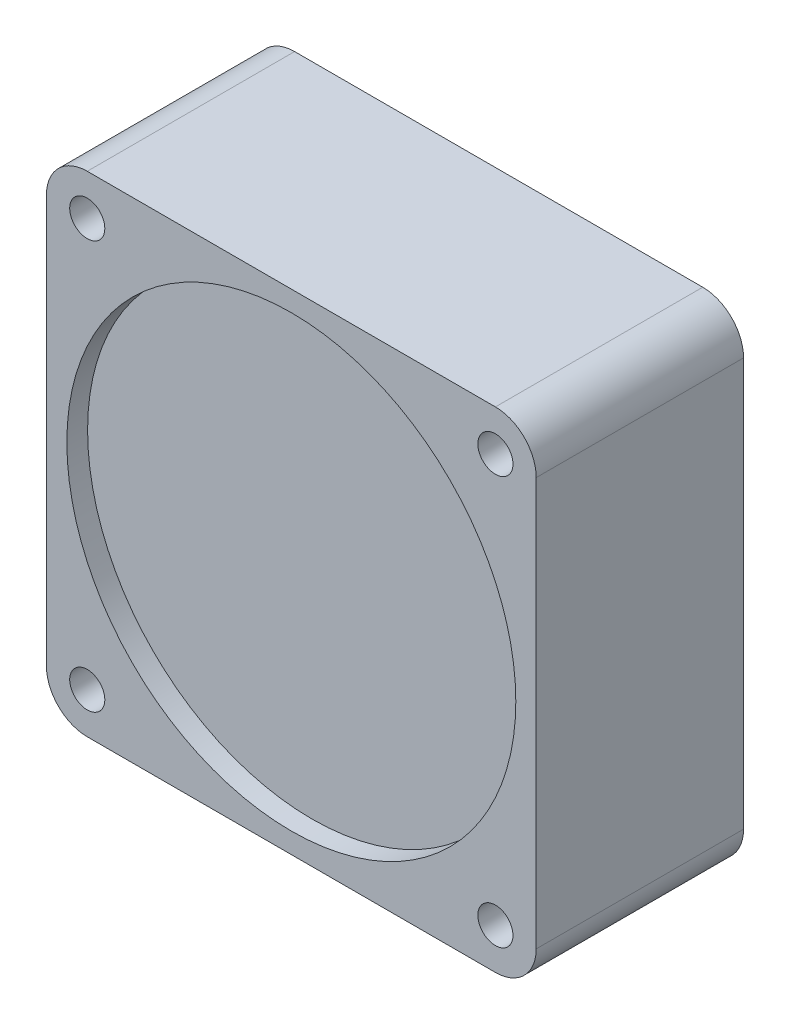
ISO-10303-21;
HEADER;
FILE_DESCRIPTION(('STEP AP214'),'2;1');
FILE_NAME('part.step','',(''),(''),'','','');
FILE_SCHEMA(('AUTOMOTIVE_DESIGN { 1 0 10303 214 1 1 1 1 }'));
ENDSEC;
DATA;
#1=APPLICATION_CONTEXT('core data for automotive mechanical design processes');
#2=APPLICATION_PROTOCOL_DEFINITION('international standard','automotive_design',2000,#1);
#3=PRODUCT_CONTEXT('',#1,'mechanical');
#4=PRODUCT('Part','Part','',(#3));
#5=PRODUCT_RELATED_PRODUCT_CATEGORY('part','',(#4));
#6=PRODUCT_DEFINITION_FORMATION('','',#4);
#7=PRODUCT_DEFINITION_CONTEXT('part definition',#1,'design');
#8=PRODUCT_DEFINITION('design','',#6,#7);
#9=PRODUCT_DEFINITION_SHAPE('','',#8);
#10=(LENGTH_UNIT() NAMED_UNIT(*) SI_UNIT(.MILLI.,.METRE.));
#11=(NAMED_UNIT(*) PLANE_ANGLE_UNIT() SI_UNIT($,.RADIAN.));
#12=(NAMED_UNIT(*) SI_UNIT($,.STERADIAN.) SOLID_ANGLE_UNIT());
#13=UNCERTAINTY_MEASURE_WITH_UNIT(LENGTH_MEASURE(1.E-05),#10,'distance_accuracy_value','');
#14=(GEOMETRIC_REPRESENTATION_CONTEXT(3) GLOBAL_UNCERTAINTY_ASSIGNED_CONTEXT((#13)) GLOBAL_UNIT_ASSIGNED_CONTEXT((#10,
#11,#12)) REPRESENTATION_CONTEXT('',''));
#15=CARTESIAN_POINT('',(0.,0.,0.));
#16=DIRECTION('',(0.,0.,1.));
#17=DIRECTION('',(1.,0.,0.));
#18=AXIS2_PLACEMENT_3D('',#15,#16,#17);
#19=CARTESIAN_POINT('',(0.,-30.,25.4));
#20=DIRECTION('',(0.,1.,0.));
#21=DIRECTION('',(0.,0.,1.));
#22=AXIS2_PLACEMENT_3D('',#19,#20,#21);
#23=PLANE('',#22);
#24=DIRECTION('',(1.,0.,0.));
#25=VECTOR('',#24,1.);
#26=CARTESIAN_POINT('',(0.,-30.,0.));
#27=LINE('',#26,#25);
#28=CARTESIAN_POINT('',(-25.000000038,-30.,0.));
#29=VERTEX_POINT('',#28);
#30=CARTESIAN_POINT('',(25.000000038,-30.,0.));
#31=VERTEX_POINT('',#30);
#32=EDGE_CURVE('E144',#29,#31,#27,.T.);
#33=ORIENTED_EDGE('',*,*,#32,.T.);
#34=DIRECTION('',(0.,0.,-1.));
#35=VECTOR('',#34,1.);
#36=CARTESIAN_POINT('',(25.000000038,-30.,25.4));
#37=LINE('',#36,#35);
#38=CARTESIAN_POINT('',(25.000000038,-30.,25.4));
#39=VERTEX_POINT('',#38);
#40=EDGE_CURVE('E11',#39,#31,#37,.T.);
#41=ORIENTED_EDGE('',*,*,#40,.F.);
#42=DIRECTION('',(1.,0.,0.));
#43=VECTOR('',#42,1.);
#44=CARTESIAN_POINT('',(0.,-30.,25.4));
#45=LINE('',#44,#43);
#46=CARTESIAN_POINT('',(-25.000000038,-30.,25.4));
#47=VERTEX_POINT('',#46);
#48=EDGE_CURVE('E187',#47,#39,#45,.T.);
#49=ORIENTED_EDGE('',*,*,#48,.F.);
#50=DIRECTION('',(0.,0.,-1.));
#51=VECTOR('',#50,1.);
#52=CARTESIAN_POINT('',(-25.000000038,-30.,25.4));
#53=LINE('',#52,#51);
#54=EDGE_CURVE('E130',#47,#29,#53,.T.);
#55=ORIENTED_EDGE('',*,*,#54,.T.);
#56=EDGE_LOOP('',(#33,#41,#49,#55));
#57=FACE_BOUND('',#56,.T.);
#58=ADVANCED_FACE('F33',(#57),#23,.F.);
#59=CARTESIAN_POINT('',(25.000000038,-25.,25.4));
#60=DIRECTION('',(0.,0.,-1.));
#61=DIRECTION('',(-1.,0.,0.));
#62=AXIS2_PLACEMENT_3D('',#59,#60,#61);
#63=CYLINDRICAL_SURFACE('',#62,5.00000000000001);
#64=CARTESIAN_POINT('',(25.000000038,-25.,0.));
#65=DIRECTION('',(0.,0.,1.));
#66=DIRECTION('',(1.,0.,0.));
#67=AXIS2_PLACEMENT_3D('',#64,#65,#66);
#68=CIRCLE('',#67,5.00000000000001);
#69=CARTESIAN_POINT('',(30.,-25.,0.));
#70=VERTEX_POINT('',#69);
#71=EDGE_CURVE('E147',#31,#70,#68,.T.);
#72=ORIENTED_EDGE('',*,*,#71,.T.);
#73=DIRECTION('',(0.,0.,-1.));
#74=VECTOR('',#73,1.);
#75=CARTESIAN_POINT('',(30.,-25.,25.4));
#76=LINE('',#75,#74);
#77=CARTESIAN_POINT('',(30.,-25.,25.4));
#78=VERTEX_POINT('',#77);
#79=EDGE_CURVE('E42',#78,#70,#76,.T.);
#80=ORIENTED_EDGE('',*,*,#79,.F.);
#81=CARTESIAN_POINT('',(25.000000038,-25.,25.4));
#82=DIRECTION('',(0.,0.,1.));
#83=DIRECTION('',(1.,0.,0.));
#84=AXIS2_PLACEMENT_3D('',#81,#82,#83);
#85=CIRCLE('',#84,5.00000000000001);
#86=EDGE_CURVE('E92',#39,#78,#85,.T.);
#87=ORIENTED_EDGE('',*,*,#86,.F.);
#88=ORIENTED_EDGE('',*,*,#40,.T.);
#89=EDGE_LOOP('',(#72,#80,#87,#88));
#90=FACE_BOUND('',#89,.T.);
#91=ADVANCED_FACE('F175',(#90),#63,.T.);
#92=CARTESIAN_POINT('',(30.,0.,25.4));
#93=DIRECTION('',(1.,0.,0.));
#94=DIRECTION('',(0.,1.,0.));
#95=AXIS2_PLACEMENT_3D('',#92,#93,#94);
#96=PLANE('',#95);
#97=DIRECTION('',(0.,-1.,0.));
#98=VECTOR('',#97,1.);
#99=CARTESIAN_POINT('',(30.,0.,0.));
#100=LINE('',#99,#98);
#101=CARTESIAN_POINT('',(30.,25.,0.));
#102=VERTEX_POINT('',#101);
#103=EDGE_CURVE('E150',#102,#70,#100,.T.);
#104=ORIENTED_EDGE('',*,*,#103,.F.);
#105=DIRECTION('',(0.,0.,-1.));
#106=VECTOR('',#105,1.);
#107=CARTESIAN_POINT('',(30.,25.,25.4));
#108=LINE('',#107,#106);
#109=CARTESIAN_POINT('',(30.,25.,25.4));
#110=VERTEX_POINT('',#109);
#111=EDGE_CURVE('E168',#110,#102,#108,.T.);
#112=ORIENTED_EDGE('',*,*,#111,.F.);
#113=DIRECTION('',(0.,-1.,0.));
#114=VECTOR('',#113,1.);
#115=CARTESIAN_POINT('',(30.,0.,25.4));
#116=LINE('',#115,#114);
#117=EDGE_CURVE('E174',#110,#78,#116,.T.);
#118=ORIENTED_EDGE('',*,*,#117,.T.);
#119=ORIENTED_EDGE('',*,*,#79,.T.);
#120=EDGE_LOOP('',(#104,#112,#118,#119));
#121=FACE_BOUND('',#120,.T.);
#122=ADVANCED_FACE('F172',(#121),#96,.T.);
#123=CARTESIAN_POINT('',(25.000000038,25.,25.4));
#124=DIRECTION('',(0.,0.,-1.));
#125=DIRECTION('',(-1.,0.,0.));
#126=AXIS2_PLACEMENT_3D('',#123,#124,#125);
#127=CYLINDRICAL_SURFACE('',#126,4.99999998099999);
#128=CARTESIAN_POINT('',(25.000000038,25.,0.));
#129=DIRECTION('',(0.,0.,1.));
#130=DIRECTION('',(1.,0.,0.));
#131=AXIS2_PLACEMENT_3D('',#128,#129,#130);
#132=CIRCLE('',#131,4.99999998099999);
#133=CARTESIAN_POINT('',(25.000000038,30.,0.));
#134=VERTEX_POINT('',#133);
#135=EDGE_CURVE('E153',#102,#134,#132,.T.);
#136=ORIENTED_EDGE('',*,*,#135,.T.);
#137=DIRECTION('',(0.,0.,-1.));
#138=VECTOR('',#137,1.);
#139=CARTESIAN_POINT('',(25.000000038,30.,25.4));
#140=LINE('',#139,#138);
#141=CARTESIAN_POINT('',(25.000000038,30.,25.4));
#142=VERTEX_POINT('',#141);
#143=EDGE_CURVE('E166',#142,#134,#140,.T.);
#144=ORIENTED_EDGE('',*,*,#143,.F.);
#145=CARTESIAN_POINT('',(25.000000038,25.,25.4));
#146=DIRECTION('',(0.,0.,1.));
#147=DIRECTION('',(1.,0.,0.));
#148=AXIS2_PLACEMENT_3D('',#145,#146,#147);
#149=CIRCLE('',#148,4.99999998099999);
#150=EDGE_CURVE('E125',#110,#142,#149,.T.);
#151=ORIENTED_EDGE('',*,*,#150,.F.);
#152=ORIENTED_EDGE('',*,*,#111,.T.);
#153=EDGE_LOOP('',(#136,#144,#151,#152));
#154=FACE_BOUND('',#153,.T.);
#155=ADVANCED_FACE('F184',(#154),#127,.T.);
#156=CARTESIAN_POINT('',(0.,30.,25.4));
#157=DIRECTION('',(0.,1.,0.));
#158=DIRECTION('',(0.,0.,1.));
#159=AXIS2_PLACEMENT_3D('',#156,#157,#158);
#160=PLANE('',#159);
#161=DIRECTION('',(1.,0.,0.));
#162=VECTOR('',#161,1.);
#163=CARTESIAN_POINT('',(0.,30.,0.));
#164=LINE('',#163,#162);
#165=CARTESIAN_POINT('',(-25.000000038,30.,0.));
#166=VERTEX_POINT('',#165);
#167=EDGE_CURVE('E156',#166,#134,#164,.T.);
#168=ORIENTED_EDGE('',*,*,#167,.F.);
#169=DIRECTION('',(0.,0.,-1.));
#170=VECTOR('',#169,1.);
#171=CARTESIAN_POINT('',(-25.000000038,30.,25.4));
#172=LINE('',#171,#170);
#173=CARTESIAN_POINT('',(-25.000000038,30.,25.4));
#174=VERTEX_POINT('',#173);
#175=EDGE_CURVE('E114',#174,#166,#172,.T.);
#176=ORIENTED_EDGE('',*,*,#175,.F.);
#177=DIRECTION('',(1.,0.,0.));
#178=VECTOR('',#177,1.);
#179=CARTESIAN_POINT('',(0.,30.,25.4));
#180=LINE('',#179,#178);
#181=EDGE_CURVE('E123',#174,#142,#180,.T.);
#182=ORIENTED_EDGE('',*,*,#181,.T.);
#183=ORIENTED_EDGE('',*,*,#143,.T.);
#184=EDGE_LOOP('',(#168,#176,#182,#183));
#185=FACE_BOUND('',#184,.T.);
#186=ADVANCED_FACE('F277',(#185),#160,.T.);
#187=CARTESIAN_POINT('',(-25.000000038,25.,25.4));
#188=DIRECTION('',(0.,0.,-1.));
#189=DIRECTION('',(-1.,0.,0.));
#190=AXIS2_PLACEMENT_3D('',#187,#188,#189);
#191=CYLINDRICAL_SURFACE('',#190,4.999999981);
#192=CARTESIAN_POINT('',(-25.000000038,25.,0.));
#193=DIRECTION('',(0.,0.,1.));
#194=DIRECTION('',(1.,0.,0.));
#195=AXIS2_PLACEMENT_3D('',#192,#193,#194);
#196=CIRCLE('',#195,4.999999981);
#197=CARTESIAN_POINT('',(-30.,25.,0.));
#198=VERTEX_POINT('',#197);
#199=EDGE_CURVE('E113',#198,#166,#196,.F.);
#200=ORIENTED_EDGE('',*,*,#199,.F.);
#201=DIRECTION('',(0.,0.,-1.));
#202=VECTOR('',#201,1.);
#203=CARTESIAN_POINT('',(-30.,25.,25.4));
#204=LINE('',#203,#202);
#205=CARTESIAN_POINT('',(-30.,25.,25.4));
#206=VERTEX_POINT('',#205);
#207=EDGE_CURVE('E107',#206,#198,#204,.T.);
#208=ORIENTED_EDGE('',*,*,#207,.F.);
#209=CARTESIAN_POINT('',(-25.000000038,25.,25.4));
#210=DIRECTION('',(0.,0.,1.));
#211=DIRECTION('',(1.,0.,0.));
#212=AXIS2_PLACEMENT_3D('',#209,#210,#211);
#213=CIRCLE('',#212,4.999999981);
#214=EDGE_CURVE('E111',#206,#174,#213,.F.);
#215=ORIENTED_EDGE('',*,*,#214,.T.);
#216=ORIENTED_EDGE('',*,*,#175,.T.);
#217=EDGE_LOOP('',(#200,#208,#215,#216));
#218=FACE_BOUND('',#217,.T.);
#219=ADVANCED_FACE('F109',(#218),#191,.T.);
#220=CARTESIAN_POINT('',(-30.,0.,25.4));
#221=DIRECTION('',(1.,0.,0.));
#222=DIRECTION('',(0.,1.,0.));
#223=AXIS2_PLACEMENT_3D('',#220,#221,#222);
#224=PLANE('',#223);
#225=DIRECTION('',(0.,-1.,0.));
#226=VECTOR('',#225,1.);
#227=CARTESIAN_POINT('',(-30.,0.,0.));
#228=LINE('',#227,#226);
#229=CARTESIAN_POINT('',(-30.,-25.,0.));
#230=VERTEX_POINT('',#229);
#231=EDGE_CURVE('E78',#198,#230,#228,.T.);
#232=ORIENTED_EDGE('',*,*,#231,.T.);
#233=DIRECTION('',(0.,0.,-1.));
#234=VECTOR('',#233,1.);
#235=CARTESIAN_POINT('',(-30.,-25.,25.4));
#236=LINE('',#235,#234);
#237=CARTESIAN_POINT('',(-30.,-25.,25.4));
#238=VERTEX_POINT('',#237);
#239=EDGE_CURVE('E115',#238,#230,#236,.T.);
#240=ORIENTED_EDGE('',*,*,#239,.F.);
#241=DIRECTION('',(0.,-1.,0.));
#242=VECTOR('',#241,1.);
#243=CARTESIAN_POINT('',(-30.,0.,25.4));
#244=LINE('',#243,#242);
#245=EDGE_CURVE('E117',#206,#238,#244,.T.);
#246=ORIENTED_EDGE('',*,*,#245,.F.);
#247=ORIENTED_EDGE('',*,*,#207,.T.);
#248=EDGE_LOOP('',(#232,#240,#246,#247));
#249=FACE_BOUND('',#248,.T.);
#250=ADVANCED_FACE('F118',(#249),#224,.F.);
#251=CARTESIAN_POINT('',(-25.000000038,25.,25.4));
#252=DIRECTION('',(0.,0.,-1.));
#253=DIRECTION('',(-1.,0.,0.));
#254=AXIS2_PLACEMENT_3D('',#251,#252,#253);
#255=CYLINDRICAL_SURFACE('',#254,2.15);
#256=CARTESIAN_POINT('',(-25.000000038,25.,25.4));
#257=DIRECTION('',(0.,0.,1.));
#258=DIRECTION('',(1.,0.,0.));
#259=AXIS2_PLACEMENT_3D('',#256,#257,#258);
#260=CIRCLE('',#259,2.15);
#261=CARTESIAN_POINT('',(-22.850000038,25.,25.4));
#262=VERTEX_POINT('',#261);
#263=EDGE_CURVE('E191',#262,#262,#260,.T.);
#264=ORIENTED_EDGE('',*,*,#263,.T.);
#265=EDGE_LOOP('',(#264));
#266=FACE_BOUND('',#265,.T.);
#267=CARTESIAN_POINT('',(-25.000000038,25.,0.));
#268=DIRECTION('',(0.,0.,1.));
#269=DIRECTION('',(1.,0.,0.));
#270=AXIS2_PLACEMENT_3D('',#267,#268,#269);
#271=CIRCLE('',#270,2.15);
#272=CARTESIAN_POINT('',(-22.850000038,25.,0.));
#273=VERTEX_POINT('',#272);
#274=EDGE_CURVE('E141',#273,#273,#271,.T.);
#275=ORIENTED_EDGE('',*,*,#274,.F.);
#276=EDGE_LOOP('',(#275));
#277=FACE_BOUND('',#276,.T.);
#278=ADVANCED_FACE('F228',(#266,#277),#255,.F.);
#279=CARTESIAN_POINT('',(25.000000038,25.,25.4));
#280=DIRECTION('',(0.,0.,-1.));
#281=DIRECTION('',(-1.,0.,0.));
#282=AXIS2_PLACEMENT_3D('',#279,#280,#281);
#283=CYLINDRICAL_SURFACE('',#282,2.15);
#284=CARTESIAN_POINT('',(25.000000038,25.,25.4));
#285=DIRECTION('',(0.,0.,1.));
#286=DIRECTION('',(1.,0.,0.));
#287=AXIS2_PLACEMENT_3D('',#284,#285,#286);
#288=CIRCLE('',#287,2.15);
#289=CARTESIAN_POINT('',(27.150000038,25.,25.4));
#290=VERTEX_POINT('',#289);
#291=EDGE_CURVE('E194',#290,#290,#288,.T.);
#292=ORIENTED_EDGE('',*,*,#291,.T.);
#293=EDGE_LOOP('',(#292));
#294=FACE_BOUND('',#293,.T.);
#295=CARTESIAN_POINT('',(25.000000038,25.,0.));
#296=DIRECTION('',(0.,0.,1.));
#297=DIRECTION('',(1.,0.,0.));
#298=AXIS2_PLACEMENT_3D('',#295,#296,#297);
#299=CIRCLE('',#298,2.15);
#300=CARTESIAN_POINT('',(27.150000038,25.,0.));
#301=VERTEX_POINT('',#300);
#302=EDGE_CURVE('E138',#301,#301,#299,.T.);
#303=ORIENTED_EDGE('',*,*,#302,.F.);
#304=EDGE_LOOP('',(#303));
#305=FACE_BOUND('',#304,.T.);
#306=ADVANCED_FACE('F231',(#294,#305),#283,.F.);
#307=CARTESIAN_POINT('',(25.000000038,-25.,25.4));
#308=DIRECTION('',(0.,0.,-1.));
#309=DIRECTION('',(-1.,0.,0.));
#310=AXIS2_PLACEMENT_3D('',#307,#308,#309);
#311=CYLINDRICAL_SURFACE('',#310,2.15);
#312=CARTESIAN_POINT('',(25.000000038,-25.,25.4));
#313=DIRECTION('',(0.,0.,1.));
#314=DIRECTION('',(1.,0.,0.));
#315=AXIS2_PLACEMENT_3D('',#312,#313,#314);
#316=CIRCLE('',#315,2.15);
#317=CARTESIAN_POINT('',(27.150000038,-25.,25.4));
#318=VERTEX_POINT('',#317);
#319=EDGE_CURVE('E197',#318,#318,#316,.T.);
#320=ORIENTED_EDGE('',*,*,#319,.T.);
#321=EDGE_LOOP('',(#320));
#322=FACE_BOUND('',#321,.T.);
#323=CARTESIAN_POINT('',(25.000000038,-25.,0.));
#324=DIRECTION('',(0.,0.,1.));
#325=DIRECTION('',(1.,0.,0.));
#326=AXIS2_PLACEMENT_3D('',#323,#324,#325);
#327=CIRCLE('',#326,2.15);
#328=CARTESIAN_POINT('',(27.150000038,-25.,0.));
#329=VERTEX_POINT('',#328);
#330=EDGE_CURVE('E134',#329,#329,#327,.T.);
#331=ORIENTED_EDGE('',*,*,#330,.F.);
#332=EDGE_LOOP('',(#331));
#333=FACE_BOUND('',#332,.T.);
#334=ADVANCED_FACE('F252',(#322,#333),#311,.F.);
#335=CARTESIAN_POINT('',(-25.000000038,-25.,25.4));
#336=DIRECTION('',(0.,0.,-1.));
#337=DIRECTION('',(-1.,0.,0.));
#338=AXIS2_PLACEMENT_3D('',#335,#336,#337);
#339=CYLINDRICAL_SURFACE('',#338,2.15);
#340=CARTESIAN_POINT('',(-25.000000038,-25.,25.4));
#341=DIRECTION('',(0.,0.,1.));
#342=DIRECTION('',(1.,0.,0.));
#343=AXIS2_PLACEMENT_3D('',#340,#341,#342);
#344=CIRCLE('',#343,2.15);
#345=CARTESIAN_POINT('',(-22.850000038,-25.,25.4));
#346=VERTEX_POINT('',#345);
#347=EDGE_CURVE('E162',#346,#346,#344,.T.);
#348=ORIENTED_EDGE('',*,*,#347,.T.);
#349=EDGE_LOOP('',(#348));
#350=FACE_BOUND('',#349,.T.);
#351=CARTESIAN_POINT('',(-25.000000038,-25.,0.));
#352=DIRECTION('',(0.,0.,1.));
#353=DIRECTION('',(1.,0.,0.));
#354=AXIS2_PLACEMENT_3D('',#351,#352,#353);
#355=CIRCLE('',#354,2.15);
#356=CARTESIAN_POINT('',(-22.850000038,-25.,0.));
#357=VERTEX_POINT('',#356);
#358=EDGE_CURVE('E131',#357,#357,#355,.T.);
#359=ORIENTED_EDGE('',*,*,#358,.F.);
#360=EDGE_LOOP('',(#359));
#361=FACE_BOUND('',#360,.T.);
#362=ADVANCED_FACE('F35',(#350,#361),#339,.F.);
#363=CARTESIAN_POINT('',(-25.000000038,-25.,25.4));
#364=DIRECTION('',(0.,0.,-1.));
#365=DIRECTION('',(-1.,0.,0.));
#366=AXIS2_PLACEMENT_3D('',#363,#364,#365);
#367=CYLINDRICAL_SURFACE('',#366,4.999999981);
#368=CARTESIAN_POINT('',(-25.000000038,-25.,0.));
#369=DIRECTION('',(0.,0.,1.));
#370=DIRECTION('',(1.,0.,0.));
#371=AXIS2_PLACEMENT_3D('',#368,#369,#370);
#372=CIRCLE('',#371,4.999999981);
#373=EDGE_CURVE('E84',#230,#29,#372,.T.);
#374=ORIENTED_EDGE('',*,*,#373,.T.);
#375=ORIENTED_EDGE('',*,*,#54,.F.);
#376=CARTESIAN_POINT('',(-25.000000038,-25.,25.4));
#377=DIRECTION('',(0.,0.,1.));
#378=DIRECTION('',(1.,0.,0.));
#379=AXIS2_PLACEMENT_3D('',#376,#377,#378);
#380=CIRCLE('',#379,4.999999981);
#381=EDGE_CURVE('E50',#238,#47,#380,.T.);
#382=ORIENTED_EDGE('',*,*,#381,.F.);
#383=ORIENTED_EDGE('',*,*,#239,.T.);
#384=EDGE_LOOP('',(#374,#375,#382,#383));
#385=FACE_BOUND('',#384,.T.);
#386=ADVANCED_FACE('F218',(#385),#367,.T.);
#387=CARTESIAN_POINT('',(0.,0.,25.4));
#388=DIRECTION('',(0.,0.,1.));
#389=DIRECTION('',(1.,0.,0.));
#390=AXIS2_PLACEMENT_3D('',#387,#388,#389);
#391=PLANE('',#390);
#392=CARTESIAN_POINT('',(0.,0.,25.4));
#393=DIRECTION('',(0.,0.,1.));
#394=DIRECTION('',(1.,0.,0.));
#395=AXIS2_PLACEMENT_3D('',#392,#393,#394);
#396=CIRCLE('',#395,27.5);
#397=CARTESIAN_POINT('',(27.5,0.,25.4));
#398=VERTEX_POINT('',#397);
#399=EDGE_CURVE('E202',#398,#398,#396,.T.);
#400=ORIENTED_EDGE('',*,*,#399,.F.);
#401=EDGE_LOOP('',(#400));
#402=FACE_BOUND('',#401,.T.);
#403=ORIENTED_EDGE('',*,*,#347,.F.);
#404=EDGE_LOOP('',(#403));
#405=FACE_BOUND('',#404,.T.);
#406=ORIENTED_EDGE('',*,*,#319,.F.);
#407=EDGE_LOOP('',(#406));
#408=FACE_BOUND('',#407,.T.);
#409=ORIENTED_EDGE('',*,*,#291,.F.);
#410=EDGE_LOOP('',(#409));
#411=FACE_BOUND('',#410,.T.);
#412=ORIENTED_EDGE('',*,*,#263,.F.);
#413=EDGE_LOOP('',(#412));
#414=FACE_BOUND('',#413,.T.);
#415=ORIENTED_EDGE('',*,*,#48,.T.);
#416=ORIENTED_EDGE('',*,*,#86,.T.);
#417=ORIENTED_EDGE('',*,*,#117,.F.);
#418=ORIENTED_EDGE('',*,*,#150,.T.);
#419=ORIENTED_EDGE('',*,*,#181,.F.);
#420=ORIENTED_EDGE('',*,*,#214,.F.);
#421=ORIENTED_EDGE('',*,*,#245,.T.);
#422=ORIENTED_EDGE('',*,*,#381,.T.);
#423=EDGE_LOOP('',(#415,#416,#417,#418,#419,#420,#421,#422));
#424=FACE_BOUND('',#423,.T.);
#425=ADVANCED_FACE('F121',(#402,#405,#408,#411,#414,#424),#391,.T.);
#426=CARTESIAN_POINT('',(0.,0.,0.));
#427=DIRECTION('',(0.,0.,1.));
#428=DIRECTION('',(1.,0.,0.));
#429=AXIS2_PLACEMENT_3D('',#426,#427,#428);
#430=PLANE('',#429);
#431=ORIENTED_EDGE('',*,*,#358,.T.);
#432=EDGE_LOOP('',(#431));
#433=FACE_BOUND('',#432,.T.);
#434=ORIENTED_EDGE('',*,*,#330,.T.);
#435=EDGE_LOOP('',(#434));
#436=FACE_BOUND('',#435,.T.);
#437=ORIENTED_EDGE('',*,*,#302,.T.);
#438=EDGE_LOOP('',(#437));
#439=FACE_BOUND('',#438,.T.);
#440=ORIENTED_EDGE('',*,*,#274,.T.);
#441=EDGE_LOOP('',(#440));
#442=FACE_BOUND('',#441,.T.);
#443=ORIENTED_EDGE('',*,*,#32,.F.);
#444=ORIENTED_EDGE('',*,*,#373,.F.);
#445=ORIENTED_EDGE('',*,*,#231,.F.);
#446=ORIENTED_EDGE('',*,*,#199,.T.);
#447=ORIENTED_EDGE('',*,*,#167,.T.);
#448=ORIENTED_EDGE('',*,*,#135,.F.);
#449=ORIENTED_EDGE('',*,*,#103,.T.);
#450=ORIENTED_EDGE('',*,*,#71,.F.);
#451=EDGE_LOOP('',(#443,#444,#445,#446,#447,#448,#449,#450));
#452=FACE_BOUND('',#451,.T.);
#453=ADVANCED_FACE('F180',(#433,#436,#439,#442,#452),#430,.F.);
#454=CARTESIAN_POINT('',(0.,0.,22.86));
#455=DIRECTION('',(0.,0.,1.));
#456=DIRECTION('',(1.,0.,0.));
#457=AXIS2_PLACEMENT_3D('',#454,#455,#456);
#458=CYLINDRICAL_SURFACE('',#457,27.5);
#459=CARTESIAN_POINT('',(0.,0.,22.86));
#460=DIRECTION('',(0.,0.,1.));
#461=DIRECTION('',(1.,0.,0.));
#462=AXIS2_PLACEMENT_3D('',#459,#460,#461);
#463=CIRCLE('',#462,27.5);
#464=CARTESIAN_POINT('',(27.5,0.,22.86));
#465=VERTEX_POINT('',#464);
#466=EDGE_CURVE('E135',#465,#465,#463,.T.);
#467=ORIENTED_EDGE('',*,*,#466,.F.);
#468=EDGE_LOOP('',(#467));
#469=FACE_BOUND('',#468,.T.);
#470=ORIENTED_EDGE('',*,*,#399,.T.);
#471=EDGE_LOOP('',(#470));
#472=FACE_BOUND('',#471,.T.);
#473=ADVANCED_FACE('F210',(#469,#472),#458,.F.);
#474=CARTESIAN_POINT('',(0.,0.,22.86));
#475=DIRECTION('',(0.,0.,1.));
#476=DIRECTION('',(1.,0.,0.));
#477=AXIS2_PLACEMENT_3D('',#474,#475,#476);
#478=PLANE('',#477);
#479=ORIENTED_EDGE('',*,*,#466,.T.);
#480=EDGE_LOOP('',(#479));
#481=FACE_BOUND('',#480,.T.);
#482=ADVANCED_FACE('F208',(#481),#478,.T.);
#483=CLOSED_SHELL('',(#58,#91,#122,#155,#186,#219,#250,#278,#306,#334,#362,#386,#425,#453,#473,#482));
#484=MANIFOLD_SOLID_BREP('B2',#483);
#485=ADVANCED_BREP_SHAPE_REPRESENTATION('',(#18,#484),#14);
#486=SHAPE_DEFINITION_REPRESENTATION(#9,#485);
ENDSEC;
END-ISO-10303-21;
